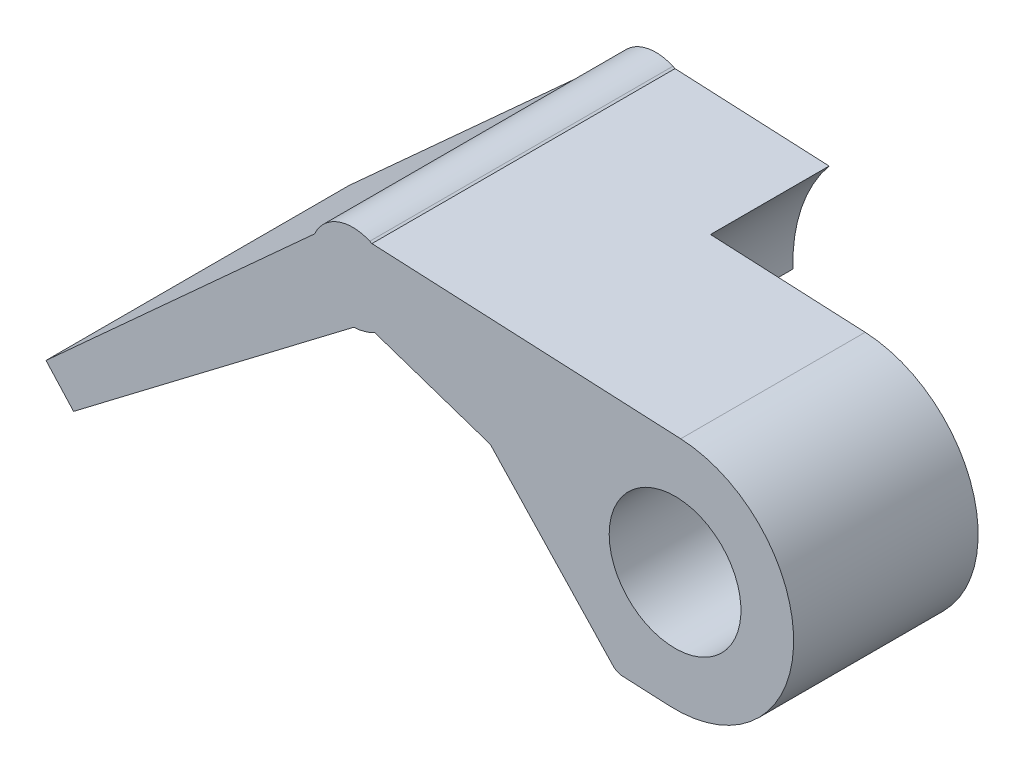
ISO-10303-21;
HEADER;
FILE_DESCRIPTION(('STEP AP214'),'2;1');
FILE_NAME('part.step','',(''),(''),'','','');
FILE_SCHEMA(('AUTOMOTIVE_DESIGN { 1 0 10303 214 1 1 1 1 }'));
ENDSEC;
DATA;
#1=APPLICATION_CONTEXT('core data for automotive mechanical design processes');
#2=APPLICATION_PROTOCOL_DEFINITION('international standard','automotive_design',2000,#1);
#3=PRODUCT_CONTEXT('',#1,'mechanical');
#4=PRODUCT('Part','Part','',(#3));
#5=PRODUCT_RELATED_PRODUCT_CATEGORY('part','',(#4));
#6=PRODUCT_DEFINITION_FORMATION('','',#4);
#7=PRODUCT_DEFINITION_CONTEXT('part definition',#1,'design');
#8=PRODUCT_DEFINITION('design','',#6,#7);
#9=PRODUCT_DEFINITION_SHAPE('','',#8);
#10=(LENGTH_UNIT() NAMED_UNIT(*) SI_UNIT(.MILLI.,.METRE.));
#11=(NAMED_UNIT(*) PLANE_ANGLE_UNIT() SI_UNIT($,.RADIAN.));
#12=(NAMED_UNIT(*) SI_UNIT($,.STERADIAN.) SOLID_ANGLE_UNIT());
#13=UNCERTAINTY_MEASURE_WITH_UNIT(LENGTH_MEASURE(1.E-05),#10,'distance_accuracy_value','');
#14=(GEOMETRIC_REPRESENTATION_CONTEXT(3) GLOBAL_UNCERTAINTY_ASSIGNED_CONTEXT((#13)) GLOBAL_UNIT_ASSIGNED_CONTEXT((#10,
#11,#12)) REPRESENTATION_CONTEXT('',''));
#15=CARTESIAN_POINT('',(0.,0.,0.));
#16=DIRECTION('',(0.,0.,1.));
#17=DIRECTION('',(1.,0.,0.));
#18=AXIS2_PLACEMENT_3D('',#15,#16,#17);
#19=CARTESIAN_POINT('',(14.6682391848409,-7.6030309256872,23.));
#20=DIRECTION('',(0.728168359692758,0.685398307513492,0.));
#21=DIRECTION('',(-0.685398307513492,0.728168359692758,0.));
#22=AXIS2_PLACEMENT_3D('',#19,#20,#21);
#23=PLANE('',#22);
#24=DIRECTION('',(-0.685398307513492,0.728168359692758,0.));
#25=VECTOR('',#24,1.);
#26=CARTESIAN_POINT('',(14.6682391848409,-7.6030309256872,9.));
#27=LINE('',#26,#25);
#28=CARTESIAN_POINT('',(14.6682391848409,-7.60303092568721,9.));
#29=VERTEX_POINT('',#28);
#30=CARTESIAN_POINT('',(5.35012395046597,2.29655098349246,9.));
#31=VERTEX_POINT('',#30);
#32=EDGE_CURVE('E229',#29,#31,#27,.T.);
#33=ORIENTED_EDGE('',*,*,#32,.F.);
#34=DIRECTION('',(0.,0.,-1.));
#35=VECTOR('',#34,1.);
#36=CARTESIAN_POINT('',(14.6682391848409,-7.60303092568721,23.));
#37=LINE('',#36,#35);
#38=CARTESIAN_POINT('',(14.6682391848409,-7.60303092568721,23.));
#39=VERTEX_POINT('',#38);
#40=EDGE_CURVE('E190',#39,#29,#37,.T.);
#41=ORIENTED_EDGE('',*,*,#40,.F.);
#42=DIRECTION('',(0.685398307513492,-0.728168359692758,0.));
#43=VECTOR('',#42,1.);
#44=CARTESIAN_POINT('',(14.6682391848409,-7.6030309256872,23.));
#45=LINE('',#44,#43);
#46=CARTESIAN_POINT('',(5.35012395046597,2.29655098349246,23.));
#47=VERTEX_POINT('',#46);
#48=EDGE_CURVE('E243',#47,#39,#45,.T.);
#49=ORIENTED_EDGE('',*,*,#48,.F.);
#50=DIRECTION('',(0.,0.,-1.));
#51=VECTOR('',#50,1.);
#52=CARTESIAN_POINT('',(5.35012395046597,2.29655098349246,23.));
#53=LINE('',#52,#51);
#54=EDGE_CURVE('E193',#47,#31,#53,.T.);
#55=ORIENTED_EDGE('',*,*,#54,.T.);
#56=EDGE_LOOP('',(#33,#41,#49,#55));
#57=FACE_BOUND('',#56,.T.);
#58=ADVANCED_FACE('F39',(#57),#23,.F.);
#59=CARTESIAN_POINT('',(15.3964795465158,-6.91746771640406,23.));
#60=DIRECTION('',(0.,0.,-1.));
#61=DIRECTION('',(-1.,0.,0.));
#62=AXIS2_PLACEMENT_3D('',#59,#60,#61);
#63=CYLINDRICAL_SURFACE('',#62,1.00016545545972);
#64=CARTESIAN_POINT('',(15.3964795465158,-6.91746771640406,9.));
#65=DIRECTION('',(0.,0.,-1.));
#66=DIRECTION('',(-1.,0.,0.));
#67=AXIS2_PLACEMENT_3D('',#64,#65,#66);
#68=CIRCLE('',#67,1.00016545545972);
#69=CARTESIAN_POINT('',(15.3487385625956,-7.91649310984974,9.));
#70=VERTEX_POINT('',#69);
#71=EDGE_CURVE('E226',#70,#29,#68,.T.);
#72=ORIENTED_EDGE('',*,*,#71,.F.);
#73=DIRECTION('',(0.,0.,-1.));
#74=VECTOR('',#73,1.);
#75=CARTESIAN_POINT('',(15.3487385625956,-7.91649310984974,23.));
#76=LINE('',#75,#74);
#77=CARTESIAN_POINT('',(15.3487385625956,-7.91649310984974,23.));
#78=VERTEX_POINT('',#77);
#79=EDGE_CURVE('E187',#78,#70,#76,.T.);
#80=ORIENTED_EDGE('',*,*,#79,.F.);
#81=CARTESIAN_POINT('',(15.3964795465158,-6.91746771640406,23.));
#82=DIRECTION('',(0.,0.,1.));
#83=DIRECTION('',(-1.,0.,0.));
#84=AXIS2_PLACEMENT_3D('',#81,#82,#83);
#85=CIRCLE('',#84,1.00016545545972);
#86=EDGE_CURVE('E245',#39,#78,#85,.T.);
#87=ORIENTED_EDGE('',*,*,#86,.F.);
#88=ORIENTED_EDGE('',*,*,#40,.T.);
#89=EDGE_LOOP('',(#72,#80,#87,#88));
#90=FACE_BOUND('',#89,.T.);
#91=ADVANCED_FACE('F275',(#90),#63,.T.);
#92=CARTESIAN_POINT('',(18.9405780520203,-8.08813834773202,23.));
#93=DIRECTION('',(0.0477330862204361,0.998860126584234,0.));
#94=DIRECTION('',(-0.998860126584234,0.0477330862204361,0.));
#95=AXIS2_PLACEMENT_3D('',#92,#93,#94);
#96=PLANE('',#95);
#97=DIRECTION('',(-0.998860126584234,0.0477330862204361,0.));
#98=VECTOR('',#97,1.);
#99=CARTESIAN_POINT('',(18.9405780520203,-8.08813834773202,9.));
#100=LINE('',#99,#98);
#101=CARTESIAN_POINT('',(18.9405780520203,-8.08813834773201,9.));
#102=VERTEX_POINT('',#101);
#103=EDGE_CURVE('E223',#102,#70,#100,.T.);
#104=ORIENTED_EDGE('',*,*,#103,.F.);
#105=DIRECTION('',(0.,0.,-1.));
#106=VECTOR('',#105,1.);
#107=CARTESIAN_POINT('',(18.9405780520203,-8.08813834773201,23.));
#108=LINE('',#107,#106);
#109=CARTESIAN_POINT('',(18.9405780520203,-8.08813834773201,23.));
#110=VERTEX_POINT('',#109);
#111=EDGE_CURVE('E184',#110,#102,#108,.T.);
#112=ORIENTED_EDGE('',*,*,#111,.F.);
#113=DIRECTION('',(0.998860126584234,-0.0477330862204361,0.));
#114=VECTOR('',#113,1.);
#115=CARTESIAN_POINT('',(18.9405780520203,-8.08813834773202,23.));
#116=LINE('',#115,#114);
#117=EDGE_CURVE('E247',#78,#110,#116,.T.);
#118=ORIENTED_EDGE('',*,*,#117,.F.);
#119=ORIENTED_EDGE('',*,*,#79,.T.);
#120=EDGE_LOOP('',(#104,#112,#118,#119));
#121=FACE_BOUND('',#120,.T.);
#122=ADVANCED_FACE('F280',(#121),#96,.F.);
#123=CARTESIAN_POINT('',(19.3672818656217,0.900777551244255,23.));
#124=DIRECTION('',(0.,0.,-1.));
#125=DIRECTION('',(-1.,0.,0.));
#126=AXIS2_PLACEMENT_3D('',#123,#124,#125);
#127=CYLINDRICAL_SURFACE('',#126,8.999038014333);
#128=CARTESIAN_POINT('',(19.3672818656217,0.900777551244255,9.));
#129=DIRECTION('',(0.,0.,-1.));
#130=DIRECTION('',(-1.,0.,0.));
#131=AXIS2_PLACEMENT_3D('',#128,#129,#130);
#132=CIRCLE('',#131,8.999038014333);
#133=CARTESIAN_POINT('',(19.7939856792232,9.88969345022052,9.));
#134=VERTEX_POINT('',#133);
#135=EDGE_CURVE('E220',#134,#102,#132,.T.);
#136=ORIENTED_EDGE('',*,*,#135,.F.);
#137=DIRECTION('',(0.,0.,-1.));
#138=VECTOR('',#137,1.);
#139=CARTESIAN_POINT('',(19.7939856792232,9.88969345022052,23.));
#140=LINE('',#139,#138);
#141=CARTESIAN_POINT('',(19.7939856792232,9.88969345022052,23.));
#142=VERTEX_POINT('',#141);
#143=EDGE_CURVE('E181',#142,#134,#140,.T.);
#144=ORIENTED_EDGE('',*,*,#143,.F.);
#145=CARTESIAN_POINT('',(19.3672818656217,0.900777551244255,23.));
#146=DIRECTION('',(0.,0.,1.));
#147=DIRECTION('',(-1.,0.,0.));
#148=AXIS2_PLACEMENT_3D('',#145,#146,#147);
#149=CIRCLE('',#148,8.999038014333);
#150=EDGE_CURVE('E249',#110,#142,#149,.T.);
#151=ORIENTED_EDGE('',*,*,#150,.F.);
#152=ORIENTED_EDGE('',*,*,#111,.T.);
#153=EDGE_LOOP('',(#136,#144,#151,#152));
#154=FACE_BOUND('',#153,.T.);
#155=ADVANCED_FACE('F284',(#154),#127,.T.);
#156=CARTESIAN_POINT('',(19.3672818656217,0.900777551244255,28.));
#157=DIRECTION('',(0.,0.,-1.));
#158=DIRECTION('',(-1.,0.,0.));
#159=AXIS2_PLACEMENT_3D('',#156,#157,#158);
#160=CYLINDRICAL_SURFACE('',#159,5.);
#161=CARTESIAN_POINT('',(19.3672818656217,0.900777551244255,23.));
#162=DIRECTION('',(0.,0.,-1.));
#163=DIRECTION('',(-1.,0.,0.));
#164=AXIS2_PLACEMENT_3D('',#161,#162,#163);
#165=CIRCLE('',#164,5.);
#166=CARTESIAN_POINT('',(14.3672818656217,0.900777551244255,23.));
#167=VERTEX_POINT('',#166);
#168=EDGE_CURVE('E161',#167,#167,#165,.T.);
#169=CARTESIAN_POINT('',(19.3672818656217,0.900777551244255,9.));
#170=DIRECTION('',(0.,0.,-1.));
#171=DIRECTION('',(-1.,0.,0.));
#172=AXIS2_PLACEMENT_3D('',#169,#170,#171);
#173=CIRCLE('',#172,5.);
#174=CARTESIAN_POINT('',(14.3672818656217,0.900777551244255,9.00000000000001));
#175=VERTEX_POINT('',#174);
#176=EDGE_CURVE('E43',#175,#175,#173,.F.);
#177=CARTESIAN_POINT('',(14.3672818656217,0.900777551244255,23.));
#178=CARTESIAN_POINT('',(14.3672818656217,0.900777551244255,22.8541666666667));
#179=CARTESIAN_POINT('',(14.3672818656217,0.900777551244255,22.7083333333333));
#180=CARTESIAN_POINT('',(14.3672818656217,0.900777551244255,22.4166666666667));
#181=CARTESIAN_POINT('',(14.3672818656217,0.900777551244255,22.2708333333333));
#182=CARTESIAN_POINT('',(14.3672818656217,0.900777551244255,21.9791666666667));
#183=CARTESIAN_POINT('',(14.3672818656217,0.900777551244255,21.8333333333333));
#184=CARTESIAN_POINT('',(14.3672818656217,0.900777551244255,21.5416666666667));
#185=CARTESIAN_POINT('',(14.3672818656217,0.900777551244255,21.3958333333333));
#186=CARTESIAN_POINT('',(14.3672818656217,0.900777551244255,21.1041666666667));
#187=CARTESIAN_POINT('',(14.3672818656217,0.900777551244255,20.9583333333333));
#188=CARTESIAN_POINT('',(14.3672818656217,0.900777551244255,20.6666666666667));
#189=CARTESIAN_POINT('',(14.3672818656217,0.900777551244255,20.5208333333333));
#190=CARTESIAN_POINT('',(14.3672818656217,0.900777551244255,20.2291666666667));
#191=CARTESIAN_POINT('',(14.3672818656217,0.900777551244255,20.0833333333333));
#192=CARTESIAN_POINT('',(14.3672818656217,0.900777551244255,19.7916666666667));
#193=CARTESIAN_POINT('',(14.3672818656217,0.900777551244255,19.6458333333333));
#194=CARTESIAN_POINT('',(14.3672818656217,0.900777551244255,19.3541666666667));
#195=CARTESIAN_POINT('',(14.3672818656217,0.900777551244255,19.2083333333333));
#196=CARTESIAN_POINT('',(14.3672818656217,0.900777551244255,18.9166666666667));
#197=CARTESIAN_POINT('',(14.3672818656217,0.900777551244255,18.7708333333333));
#198=CARTESIAN_POINT('',(14.3672818656217,0.900777551244255,18.4791666666667));
#199=CARTESIAN_POINT('',(14.3672818656217,0.900777551244255,18.3333333333333));
#200=CARTESIAN_POINT('',(14.3672818656217,0.900777551244255,18.0416666666667));
#201=CARTESIAN_POINT('',(14.3672818656217,0.900777551244255,17.8958333333333));
#202=CARTESIAN_POINT('',(14.3672818656217,0.900777551244255,17.6041666666667));
#203=CARTESIAN_POINT('',(14.3672818656217,0.900777551244255,17.4583333333333));
#204=CARTESIAN_POINT('',(14.3672818656217,0.900777551244255,17.1666666666667));
#205=CARTESIAN_POINT('',(14.3672818656217,0.900777551244255,17.0208333333333));
#206=CARTESIAN_POINT('',(14.3672818656217,0.900777551244255,16.7291666666667));
#207=CARTESIAN_POINT('',(14.3672818656217,0.900777551244255,16.5833333333333));
#208=CARTESIAN_POINT('',(14.3672818656217,0.900777551244255,16.2916666666667));
#209=CARTESIAN_POINT('',(14.3672818656217,0.900777551244255,16.1458333333333));
#210=CARTESIAN_POINT('',(14.3672818656217,0.900777551244255,15.8541666666667));
#211=CARTESIAN_POINT('',(14.3672818656217,0.900777551244255,15.7083333333333));
#212=CARTESIAN_POINT('',(14.3672818656217,0.900777551244255,15.4166666666667));
#213=CARTESIAN_POINT('',(14.3672818656217,0.900777551244255,15.2708333333333));
#214=CARTESIAN_POINT('',(14.3672818656217,0.900777551244255,14.9791666666667));
#215=CARTESIAN_POINT('',(14.3672818656217,0.900777551244255,14.8333333333333));
#216=CARTESIAN_POINT('',(14.3672818656217,0.900777551244255,14.5416666666667));
#217=CARTESIAN_POINT('',(14.3672818656217,0.900777551244255,14.3958333333333));
#218=CARTESIAN_POINT('',(14.3672818656217,0.900777551244255,14.1041666666667));
#219=CARTESIAN_POINT('',(14.3672818656217,0.900777551244255,13.9583333333333));
#220=CARTESIAN_POINT('',(14.3672818656217,0.900777551244255,13.6666666666667));
#221=CARTESIAN_POINT('',(14.3672818656217,0.900777551244255,13.5208333333333));
#222=CARTESIAN_POINT('',(14.3672818656217,0.900777551244255,13.2291666666667));
#223=CARTESIAN_POINT('',(14.3672818656217,0.900777551244255,13.0833333333333));
#224=CARTESIAN_POINT('',(14.3672818656217,0.900777551244255,12.7916666666667));
#225=CARTESIAN_POINT('',(14.3672818656217,0.900777551244255,12.6458333333333));
#226=CARTESIAN_POINT('',(14.3672818656217,0.900777551244255,12.3541666666667));
#227=CARTESIAN_POINT('',(14.3672818656217,0.900777551244255,12.2083333333333));
#228=CARTESIAN_POINT('',(14.3672818656217,0.900777551244255,11.9166666666667));
#229=CARTESIAN_POINT('',(14.3672818656217,0.900777551244255,11.7708333333333));
#230=CARTESIAN_POINT('',(14.3672818656217,0.900777551244255,11.4791666666667));
#231=CARTESIAN_POINT('',(14.3672818656217,0.900777551244255,11.3333333333333));
#232=CARTESIAN_POINT('',(14.3672818656217,0.900777551244255,11.0416666666667));
#233=CARTESIAN_POINT('',(14.3672818656217,0.900777551244255,10.8958333333333));
#234=CARTESIAN_POINT('',(14.3672818656217,0.900777551244255,10.6041666666667));
#235=CARTESIAN_POINT('',(14.3672818656217,0.900777551244255,10.4583333333333));
#236=CARTESIAN_POINT('',(14.3672818656217,0.900777551244255,10.1666666666667));
#237=CARTESIAN_POINT('',(14.3672818656217,0.900777551244255,10.0208333333333));
#238=CARTESIAN_POINT('',(14.3672818656217,0.900777551244255,9.72916666666667));
#239=CARTESIAN_POINT('',(14.3672818656217,0.900777551244255,9.58333333333334));
#240=CARTESIAN_POINT('',(14.3672818656217,0.900777551244255,9.29166666666667));
#241=CARTESIAN_POINT('',(14.3672818656217,0.900777551244255,9.14583333333334));
#242=CARTESIAN_POINT('',(14.3672818656217,0.900777551244255,9.00000000000001));
#243=B_SPLINE_CURVE_WITH_KNOTS('',3,(#177,#178,#179,#180,#181,#182,#183,#184,#185,#186,#187,
#188,#189,#190,#191,#192,#193,#194,#195,#196,#197,#198,#199,#200,#201,#202,#203,#204,#205,#206,
#207,#208,#209,#210,#211,#212,#213,#214,#215,#216,#217,#218,#219,#220,#221,#222,#223,#224,#225,
#226,#227,#228,#229,#230,#231,#232,#233,#234,#235,#236,#237,#238,#239,#240,#241,#242),
.UNSPECIFIED.,.F.,.F.,(4,2,2,2,2,2,2,2,2,2,2,2,2,2,2,2,2,2,2,2,2,2,2,2,2,2,2,2,2,2,2,2,4),(0.,
0.4375,0.875000000000001,1.3125,1.75,2.1875,2.625,3.0625,3.5,3.9375,4.375,4.8125,5.25,5.6875,
6.125,6.5625,7.,7.4375,7.875,8.3125,8.75,9.1875,9.625,10.0625,10.5,10.9375,11.375,11.8125,12.25,
12.6875,13.125,13.5625,14.),.UNSPECIFIED.);
#244=EDGE_CURVE('BSEAM324',#167,#175,#243,.T.);
#245=ORIENTED_EDGE('',*,*,#168,.F.);
#246=ORIENTED_EDGE('',*,*,#176,.F.);
#247=ORIENTED_EDGE('',*,*,#244,.T.);
#248=ORIENTED_EDGE('',*,*,#244,.F.);
#249=EDGE_LOOP('',(#245,#247,#246,#248));
#250=FACE_BOUND('',#249,.T.);
#251=ADVANCED_FACE('F324',(#250),#160,.F.);
#252=CARTESIAN_POINT('',(-5.01413386203409,4.81339668661748,23.));
#253=DIRECTION('',(-0.605097912293867,0.796151063892779,0.));
#254=DIRECTION('',(-0.796151063892779,-0.605097912293867,0.));
#255=AXIS2_PLACEMENT_3D('',#252,#253,#254);
#256=PLANE('',#255);
#257=DIRECTION('',(0.796151063892779,0.605097912293867,0.));
#258=VECTOR('',#257,1.);
#259=CARTESIAN_POINT('',(-5.01413386203409,4.81339668661748,0.));
#260=LINE('',#259,#258);
#261=CARTESIAN_POINT('',(-26.2781109128153,-11.347842937406,0.));
#262=VERTEX_POINT('',#261);
#263=CARTESIAN_POINT('',(-5.01413386203409,4.8133966866175,0.));
#264=VERTEX_POINT('',#263);
#265=EDGE_CURVE('E157',#262,#264,#260,.T.);
#266=ORIENTED_EDGE('',*,*,#265,.T.);
#267=DIRECTION('',(0.,0.,-1.));
#268=VECTOR('',#267,1.);
#269=CARTESIAN_POINT('',(-5.01413386203409,4.8133966866175,23.));
#270=LINE('',#269,#268);
#271=CARTESIAN_POINT('',(-5.01413386203409,4.8133966866175,23.));
#272=VERTEX_POINT('',#271);
#273=EDGE_CURVE('E11',#272,#264,#270,.T.);
#274=ORIENTED_EDGE('',*,*,#273,.F.);
#275=DIRECTION('',(0.796151063892779,0.605097912293867,0.));
#276=VECTOR('',#275,1.);
#277=CARTESIAN_POINT('',(-5.01413386203409,4.81339668661748,23.));
#278=LINE('',#277,#276);
#279=CARTESIAN_POINT('',(-26.2781109128153,-11.347842937406,23.));
#280=VERTEX_POINT('',#279);
#281=EDGE_CURVE('E174',#280,#272,#278,.T.);
#282=ORIENTED_EDGE('',*,*,#281,.F.);
#283=DIRECTION('',(0.,0.,-1.));
#284=VECTOR('',#283,1.);
#285=CARTESIAN_POINT('',(-26.2781109128153,-11.347842937406,23.));
#286=LINE('',#285,#284);
#287=EDGE_CURVE('E153',#280,#262,#286,.T.);
#288=ORIENTED_EDGE('',*,*,#287,.T.);
#289=EDGE_LOOP('',(#266,#274,#282,#288));
#290=FACE_BOUND('',#289,.T.);
#291=ADVANCED_FACE('F41',(#290),#256,.F.);
#292=CARTESIAN_POINT('',(-5.18967507805901,8.54149962220621,23.));
#293=DIRECTION('',(0.,0.,-1.));
#294=DIRECTION('',(-1.,0.,0.));
#295=AXIS2_PLACEMENT_3D('',#292,#293,#294);
#296=CYLINDRICAL_SURFACE('',#295,3.73223340868021);
#297=CARTESIAN_POINT('',(-5.18967507805901,8.54149962220621,0.));
#298=DIRECTION('',(0.,0.,1.));
#299=DIRECTION('',(-1.,0.,0.));
#300=AXIS2_PLACEMENT_3D('',#297,#298,#299);
#301=CIRCLE('',#300,3.73223340868021);
#302=CARTESIAN_POINT('',(-3.41916315890911,5.25594734579715,0.));
#303=VERTEX_POINT('',#302);
#304=EDGE_CURVE('E160',#264,#303,#301,.T.);
#305=ORIENTED_EDGE('',*,*,#304,.T.);
#306=DIRECTION('',(0.,0.,-1.));
#307=VECTOR('',#306,1.);
#308=CARTESIAN_POINT('',(-3.41916315890911,5.25594734579715,23.));
#309=LINE('',#308,#307);
#310=CARTESIAN_POINT('',(-3.41916315890911,5.25594734579715,23.));
#311=VERTEX_POINT('',#310);
#312=EDGE_CURVE('E48',#311,#303,#309,.T.);
#313=ORIENTED_EDGE('',*,*,#312,.F.);
#314=CARTESIAN_POINT('',(-5.18967507805901,8.54149962220621,23.));
#315=DIRECTION('',(0.,0.,1.));
#316=DIRECTION('',(-1.,0.,0.));
#317=AXIS2_PLACEMENT_3D('',#314,#315,#316);
#318=CIRCLE('',#317,3.73223340868021);
#319=EDGE_CURVE('E102',#272,#311,#318,.T.);
#320=ORIENTED_EDGE('',*,*,#319,.F.);
#321=ORIENTED_EDGE('',*,*,#273,.T.);
#322=EDGE_LOOP('',(#305,#313,#320,#321));
#323=FACE_BOUND('',#322,.T.);
#324=ADVANCED_FACE('F318',(#323),#296,.T.);
#325=CARTESIAN_POINT('',(5.35012395046597,2.29655098349246,23.));
#326=DIRECTION('',(0.319755554751399,0.947500071348612,0.));
#327=DIRECTION('',(-0.947500071348612,0.319755554751399,0.));
#328=AXIS2_PLACEMENT_3D('',#325,#326,#327);
#329=PLANE('',#328);
#330=DIRECTION('',(0.947500071348612,-0.319755554751399,0.));
#331=VECTOR('',#330,1.);
#332=CARTESIAN_POINT('',(5.35012395046597,2.29655098349246,0.));
#333=LINE('',#332,#331);
#334=CARTESIAN_POINT('',(5.31730225307227,2.30762741543728,0.));
#335=VERTEX_POINT('',#334);
#336=EDGE_CURVE('E163',#303,#335,#333,.T.);
#337=ORIENTED_EDGE('',*,*,#336,.T.);
#338=DIRECTION('',(0.,0.,-1.));
#339=VECTOR('',#338,1.);
#340=CARTESIAN_POINT('',(5.31730225307227,2.30762741543728,9.));
#341=LINE('',#340,#339);
#342=CARTESIAN_POINT('',(5.31730225307227,2.30762741543728,9.));
#343=VERTEX_POINT('',#342);
#344=EDGE_CURVE('E55',#335,#343,#341,.F.);
#345=ORIENTED_EDGE('',*,*,#344,.T.);
#346=DIRECTION('',(-0.947500071348612,0.319755554751399,0.));
#347=VECTOR('',#346,1.);
#348=CARTESIAN_POINT('',(5.35012395046597,2.29655098349246,9.));
#349=LINE('',#348,#347);
#350=EDGE_CURVE('E232',#31,#343,#349,.T.);
#351=ORIENTED_EDGE('',*,*,#350,.F.);
#352=ORIENTED_EDGE('',*,*,#54,.F.);
#353=DIRECTION('',(0.947500071348612,-0.319755554751399,0.));
#354=VECTOR('',#353,1.);
#355=CARTESIAN_POINT('',(5.35012395046597,2.29655098349246,23.));
#356=LINE('',#355,#354);
#357=EDGE_CURVE('E202',#311,#47,#356,.T.);
#358=ORIENTED_EDGE('',*,*,#357,.F.);
#359=ORIENTED_EDGE('',*,*,#312,.T.);
#360=EDGE_LOOP('',(#337,#345,#351,#352,#358,#359));
#361=FACE_BOUND('',#360,.T.);
#362=ADVANCED_FACE('F200',(#361),#329,.F.);
#363=CARTESIAN_POINT('',(-3.63753671352174,11.0019877553225,23.));
#364=DIRECTION('',(-0.0474166030771076,-0.998875200289119,0.));
#365=DIRECTION('',(0.998875200289119,-0.0474166030771076,0.));
#366=AXIS2_PLACEMENT_3D('',#363,#364,#365);
#367=PLANE('',#366);
#368=DIRECTION('',(0.998875200289119,-0.0474166030771076,0.));
#369=VECTOR('',#368,1.);
#370=CARTESIAN_POINT('',(-3.63753671352174,11.0019877553225,9.));
#371=LINE('',#370,#369);
#372=CARTESIAN_POINT('',(8.05612052798466,10.4468898774497,9.));
#373=VERTEX_POINT('',#372);
#374=EDGE_CURVE('E217',#373,#134,#371,.T.);
#375=ORIENTED_EDGE('',*,*,#374,.F.);
#376=DIRECTION('',(0.,0.,-1.));
#377=VECTOR('',#376,1.);
#378=CARTESIAN_POINT('',(8.05612052798466,10.4468898774497,9.));
#379=LINE('',#378,#377);
#380=CARTESIAN_POINT('',(8.05612052798466,10.4468898774497,0.));
#381=VERTEX_POINT('',#380);
#382=EDGE_CURVE('E235',#373,#381,#379,.T.);
#383=ORIENTED_EDGE('',*,*,#382,.T.);
#384=DIRECTION('',(-0.998875200289119,0.0474166030771076,0.));
#385=VECTOR('',#384,1.);
#386=CARTESIAN_POINT('',(-3.63753671352174,11.0019877553225,0.));
#387=LINE('',#386,#385);
#388=CARTESIAN_POINT('',(-3.63753671352174,11.0019877553225,0.));
#389=VERTEX_POINT('',#388);
#390=EDGE_CURVE('E166',#381,#389,#387,.T.);
#391=ORIENTED_EDGE('',*,*,#390,.T.);
#392=DIRECTION('',(0.,0.,-1.));
#393=VECTOR('',#392,1.);
#394=CARTESIAN_POINT('',(-3.63753671352174,11.0019877553225,23.));
#395=LINE('',#394,#393);
#396=CARTESIAN_POINT('',(-3.63753671352174,11.0019877553225,23.));
#397=VERTEX_POINT('',#396);
#398=EDGE_CURVE('E178',#397,#389,#395,.T.);
#399=ORIENTED_EDGE('',*,*,#398,.F.);
#400=DIRECTION('',(-0.998875200289119,0.0474166030771076,0.));
#401=VECTOR('',#400,1.);
#402=CARTESIAN_POINT('',(-3.63753671352174,11.0019877553225,23.));
#403=LINE('',#402,#401);
#404=EDGE_CURVE('E251',#142,#397,#403,.T.);
#405=ORIENTED_EDGE('',*,*,#404,.F.);
#406=ORIENTED_EDGE('',*,*,#143,.T.);
#407=EDGE_LOOP('',(#375,#383,#391,#399,#405,#406));
#408=FACE_BOUND('',#407,.T.);
#409=ADVANCED_FACE('F258',(#408),#367,.F.);
#410=CARTESIAN_POINT('',(-3.80093806125281,11.0745661202112,23.));
#411=DIRECTION('',(-0.405930824808933,-0.913903805370094,0.));
#412=DIRECTION('',(0.913903805370095,-0.405930824808933,0.));
#413=AXIS2_PLACEMENT_3D('',#410,#411,#412);
#414=PLANE('',#413);
#415=DIRECTION('',(-0.913903805370094,0.405930824808933,0.));
#416=VECTOR('',#415,1.);
#417=CARTESIAN_POINT('',(-3.80093806125281,11.0745661202112,0.));
#418=LINE('',#417,#416);
#419=CARTESIAN_POINT('',(-3.8009380612528,11.0745661202112,0.));
#420=VERTEX_POINT('',#419);
#421=EDGE_CURVE('E168',#389,#420,#418,.T.);
#422=ORIENTED_EDGE('',*,*,#421,.T.);
#423=DIRECTION('',(0.,0.,-1.));
#424=VECTOR('',#423,1.);
#425=CARTESIAN_POINT('',(-3.8009380612528,11.0745661202112,23.));
#426=LINE('',#425,#424);
#427=CARTESIAN_POINT('',(-3.8009380612528,11.0745661202112,23.));
#428=VERTEX_POINT('',#427);
#429=EDGE_CURVE('E148',#428,#420,#426,.T.);
#430=ORIENTED_EDGE('',*,*,#429,.F.);
#431=DIRECTION('',(-0.913903805370094,0.405930824808933,0.));
#432=VECTOR('',#431,1.);
#433=CARTESIAN_POINT('',(-3.80093806125281,11.0745661202112,23.));
#434=LINE('',#433,#432);
#435=EDGE_CURVE('E136',#397,#428,#434,.T.);
#436=ORIENTED_EDGE('',*,*,#435,.F.);
#437=ORIENTED_EDGE('',*,*,#398,.T.);
#438=EDGE_LOOP('',(#422,#430,#436,#437));
#439=FACE_BOUND('',#438,.T.);
#440=ADVANCED_FACE('F260',(#439),#414,.F.);
#441=CARTESIAN_POINT('',(-5.0893978390848,8.17375587851188,23.));
#442=DIRECTION('',(0.,0.,-1.));
#443=DIRECTION('',(-1.,0.,0.));
#444=AXIS2_PLACEMENT_3D('',#441,#442,#443);
#445=CYLINDRICAL_SURFACE('',#444,3.17408705889406);
#446=CARTESIAN_POINT('',(-5.0893978390848,8.17375587851188,0.));
#447=DIRECTION('',(0.,0.,1.));
#448=DIRECTION('',(-1.,0.,0.));
#449=AXIS2_PLACEMENT_3D('',#446,#447,#448);
#450=CIRCLE('',#449,3.17408705889406);
#451=CARTESIAN_POINT('',(-7.9902080807841,9.46221565634403,0.));
#452=VERTEX_POINT('',#451);
#453=EDGE_CURVE('E145',#420,#452,#450,.T.);
#454=ORIENTED_EDGE('',*,*,#453,.T.);
#455=DIRECTION('',(0.,0.,-1.));
#456=VECTOR('',#455,1.);
#457=CARTESIAN_POINT('',(-7.9902080807841,9.46221565634403,23.));
#458=LINE('',#457,#456);
#459=CARTESIAN_POINT('',(-7.9902080807841,9.46221565634403,23.));
#460=VERTEX_POINT('',#459);
#461=EDGE_CURVE('E142',#460,#452,#458,.T.);
#462=ORIENTED_EDGE('',*,*,#461,.F.);
#463=CARTESIAN_POINT('',(-5.0893978390848,8.17375587851188,23.));
#464=DIRECTION('',(0.,0.,1.));
#465=DIRECTION('',(-1.,0.,0.));
#466=AXIS2_PLACEMENT_3D('',#463,#464,#465);
#467=CIRCLE('',#466,3.17408705889406);
#468=EDGE_CURVE('E129',#428,#460,#467,.T.);
#469=ORIENTED_EDGE('',*,*,#468,.F.);
#470=ORIENTED_EDGE('',*,*,#429,.T.);
#471=EDGE_LOOP('',(#454,#462,#469,#470));
#472=FACE_BOUND('',#471,.T.);
#473=ADVANCED_FACE('F143',(#472),#445,.T.);
#474=CARTESIAN_POINT('',(-28.3721660885966,-9.04384208291378,23.));
#475=DIRECTION('',(0.672215344748669,-0.740355678227991,0.));
#476=DIRECTION('',(0.740355678227991,0.672215344748669,0.));
#477=AXIS2_PLACEMENT_3D('',#474,#475,#476);
#478=PLANE('',#477);
#479=DIRECTION('',(-0.740355678227991,-0.672215344748669,0.));
#480=VECTOR('',#479,1.);
#481=CARTESIAN_POINT('',(-28.3721660885966,-9.04384208291378,0.));
#482=LINE('',#481,#480);
#483=CARTESIAN_POINT('',(-28.3721660885966,-9.04384208291378,0.));
#484=VERTEX_POINT('',#483);
#485=EDGE_CURVE('E171',#452,#484,#482,.T.);
#486=ORIENTED_EDGE('',*,*,#485,.T.);
#487=DIRECTION('',(0.,0.,-1.));
#488=VECTOR('',#487,1.);
#489=CARTESIAN_POINT('',(-28.3721660885966,-9.04384208291378,23.));
#490=LINE('',#489,#488);
#491=CARTESIAN_POINT('',(-28.3721660885966,-9.04384208291378,23.));
#492=VERTEX_POINT('',#491);
#493=EDGE_CURVE('E149',#492,#484,#490,.T.);
#494=ORIENTED_EDGE('',*,*,#493,.F.);
#495=DIRECTION('',(-0.740355678227991,-0.672215344748669,0.));
#496=VECTOR('',#495,1.);
#497=CARTESIAN_POINT('',(-28.3721660885966,-9.04384208291378,23.));
#498=LINE('',#497,#496);
#499=EDGE_CURVE('E133',#460,#492,#498,.T.);
#500=ORIENTED_EDGE('',*,*,#499,.F.);
#501=ORIENTED_EDGE('',*,*,#461,.T.);
#502=EDGE_LOOP('',(#486,#494,#500,#501));
#503=FACE_BOUND('',#502,.T.);
#504=ADVANCED_FACE('F151',(#503),#478,.F.);
#505=CARTESIAN_POINT('',(-26.2781109128153,-11.347842937406,23.));
#506=DIRECTION('',(0.740018572222376,0.672586435163508,0.));
#507=DIRECTION('',(-0.672586435163508,0.740018572222376,0.));
#508=AXIS2_PLACEMENT_3D('',#505,#506,#507);
#509=PLANE('',#508);
#510=DIRECTION('',(0.672586435163508,-0.740018572222376,0.));
#511=VECTOR('',#510,1.);
#512=CARTESIAN_POINT('',(-26.2781109128153,-11.347842937406,0.));
#513=LINE('',#512,#511);
#514=EDGE_CURVE('E94',#484,#262,#513,.T.);
#515=ORIENTED_EDGE('',*,*,#514,.T.);
#516=ORIENTED_EDGE('',*,*,#287,.F.);
#517=DIRECTION('',(0.672586435163508,-0.740018572222376,0.));
#518=VECTOR('',#517,1.);
#519=CARTESIAN_POINT('',(-26.2781109128153,-11.347842937406,23.));
#520=LINE('',#519,#518);
#521=EDGE_CURVE('E64',#492,#280,#520,.T.);
#522=ORIENTED_EDGE('',*,*,#521,.F.);
#523=ORIENTED_EDGE('',*,*,#493,.T.);
#524=EDGE_LOOP('',(#515,#516,#522,#523));
#525=FACE_BOUND('',#524,.T.);
#526=ADVANCED_FACE('F261',(#525),#509,.F.);
#527=CARTESIAN_POINT('',(-5.0893978390848,8.17375587851188,23.));
#528=DIRECTION('',(0.,0.,-1.));
#529=DIRECTION('',(-1.,0.,0.));
#530=AXIS2_PLACEMENT_3D('',#527,#528,#529);
#531=PLANE('',#530);
#532=ORIENTED_EDGE('',*,*,#168,.T.);
#533=EDGE_LOOP('',(#532));
#534=FACE_BOUND('',#533,.T.);
#535=ORIENTED_EDGE('',*,*,#281,.T.);
#536=ORIENTED_EDGE('',*,*,#319,.T.);
#537=ORIENTED_EDGE('',*,*,#357,.T.);
#538=ORIENTED_EDGE('',*,*,#48,.T.);
#539=ORIENTED_EDGE('',*,*,#86,.T.);
#540=ORIENTED_EDGE('',*,*,#117,.T.);
#541=ORIENTED_EDGE('',*,*,#150,.T.);
#542=ORIENTED_EDGE('',*,*,#404,.T.);
#543=ORIENTED_EDGE('',*,*,#435,.T.);
#544=ORIENTED_EDGE('',*,*,#468,.T.);
#545=ORIENTED_EDGE('',*,*,#499,.T.);
#546=ORIENTED_EDGE('',*,*,#521,.T.);
#547=EDGE_LOOP('',(#535,#536,#537,#538,#539,#540,#541,#542,#543,#544,#545,#546));
#548=FACE_BOUND('',#547,.T.);
#549=ADVANCED_FACE('F131',(#534,#548),#531,.F.);
#550=CARTESIAN_POINT('',(-5.0893978390848,8.17375587851188,0.));
#551=DIRECTION('',(0.,0.,-1.));
#552=DIRECTION('',(-1.,0.,0.));
#553=AXIS2_PLACEMENT_3D('',#550,#551,#552);
#554=PLANE('',#553);
#555=CARTESIAN_POINT('',(17.551723982435,2.72124003508278,0.));
#556=DIRECTION('',(0.,0.,-1.));
#557=DIRECTION('',(-1.,0.,0.));
#558=AXIS2_PLACEMENT_3D('',#555,#556,#557);
#559=CIRCLE('',#558,12.2414112932714);
#560=EDGE_CURVE('E207',#335,#381,#559,.T.);
#561=ORIENTED_EDGE('',*,*,#560,.F.);
#562=ORIENTED_EDGE('',*,*,#336,.F.);
#563=ORIENTED_EDGE('',*,*,#304,.F.);
#564=ORIENTED_EDGE('',*,*,#265,.F.);
#565=ORIENTED_EDGE('',*,*,#514,.F.);
#566=ORIENTED_EDGE('',*,*,#485,.F.);
#567=ORIENTED_EDGE('',*,*,#453,.F.);
#568=ORIENTED_EDGE('',*,*,#421,.F.);
#569=ORIENTED_EDGE('',*,*,#390,.F.);
#570=EDGE_LOOP('',(#561,#562,#563,#564,#565,#566,#567,#568,#569));
#571=FACE_BOUND('',#570,.T.);
#572=ADVANCED_FACE('F204',(#571),#554,.T.);
#573=CARTESIAN_POINT('',(17.551723982435,2.72124003508278,9.));
#574=DIRECTION('',(0.,0.,-1.));
#575=DIRECTION('',(-1.,0.,0.));
#576=AXIS2_PLACEMENT_3D('',#573,#574,#575);
#577=CYLINDRICAL_SURFACE('',#576,12.2414112932714);
#578=ORIENTED_EDGE('',*,*,#560,.T.);
#579=ORIENTED_EDGE('',*,*,#382,.F.);
#580=CARTESIAN_POINT('',(17.551723982435,2.72124003508278,9.));
#581=DIRECTION('',(0.,0.,-1.));
#582=DIRECTION('',(-1.,0.,0.));
#583=AXIS2_PLACEMENT_3D('',#580,#581,#582);
#584=CIRCLE('',#583,12.2414112932714);
#585=EDGE_CURVE('E212',#343,#373,#584,.T.);
#586=ORIENTED_EDGE('',*,*,#585,.F.);
#587=ORIENTED_EDGE('',*,*,#344,.F.);
#588=EDGE_LOOP('',(#578,#579,#586,#587));
#589=FACE_BOUND('',#588,.T.);
#590=ADVANCED_FACE('F296',(#589),#577,.F.);
#591=CARTESIAN_POINT('',(17.551723982435,2.72124003508278,9.));
#592=DIRECTION('',(0.,0.,-1.));
#593=DIRECTION('',(-1.,0.,0.));
#594=AXIS2_PLACEMENT_3D('',#591,#592,#593);
#595=PLANE('',#594);
#596=ORIENTED_EDGE('',*,*,#176,.T.);
#597=EDGE_LOOP('',(#596));
#598=FACE_BOUND('',#597,.T.);
#599=ORIENTED_EDGE('',*,*,#350,.T.);
#600=ORIENTED_EDGE('',*,*,#585,.T.);
#601=ORIENTED_EDGE('',*,*,#374,.T.);
#602=ORIENTED_EDGE('',*,*,#135,.T.);
#603=ORIENTED_EDGE('',*,*,#103,.T.);
#604=ORIENTED_EDGE('',*,*,#71,.T.);
#605=ORIENTED_EDGE('',*,*,#32,.T.);
#606=EDGE_LOOP('',(#599,#600,#601,#602,#603,#604,#605));
#607=FACE_BOUND('',#606,.T.);
#608=ADVANCED_FACE('F295',(#598,#607),#595,.T.);
#609=CLOSED_SHELL('',(#58,#91,#122,#155,#251,#291,#324,#362,#409,#440,#473,#504,#526,#549,#572,
#590,#608));
#610=MANIFOLD_SOLID_BREP('B2',#609);
#611=ADVANCED_BREP_SHAPE_REPRESENTATION('',(#18,#610),#14);
#612=SHAPE_DEFINITION_REPRESENTATION(#9,#611);
ENDSEC;
END-ISO-10303-21;
